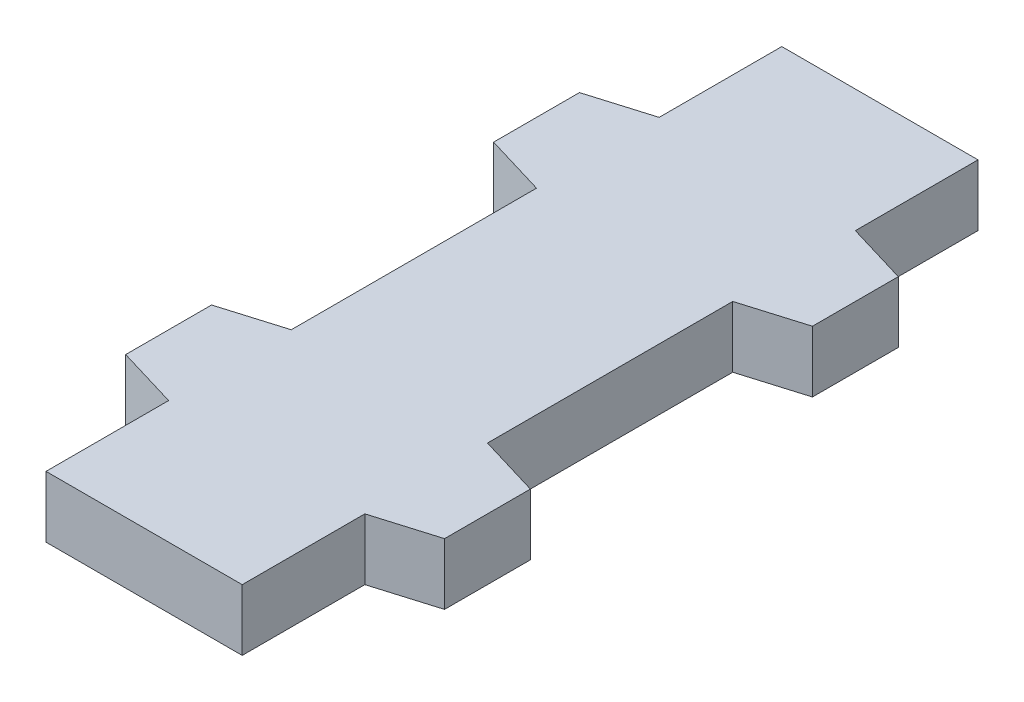
ISO-10303-21;
HEADER;
FILE_DESCRIPTION(('STEP AP214'),'2;1');
FILE_NAME('part.step','',(''),(''),'','','');
FILE_SCHEMA(('AUTOMOTIVE_DESIGN { 1 0 10303 214 1 1 1 1 }'));
ENDSEC;
DATA;
#1=APPLICATION_CONTEXT('core data for automotive mechanical design processes');
#2=APPLICATION_PROTOCOL_DEFINITION('international standard','automotive_design',2000,#1);
#3=PRODUCT_CONTEXT('',#1,'mechanical');
#4=PRODUCT('Part','Part','',(#3));
#5=PRODUCT_RELATED_PRODUCT_CATEGORY('part','',(#4));
#6=PRODUCT_DEFINITION_FORMATION('','',#4);
#7=PRODUCT_DEFINITION_CONTEXT('part definition',#1,'design');
#8=PRODUCT_DEFINITION('design','',#6,#7);
#9=PRODUCT_DEFINITION_SHAPE('','',#8);
#10=(LENGTH_UNIT() NAMED_UNIT(*) SI_UNIT(.MILLI.,.METRE.));
#11=(NAMED_UNIT(*) PLANE_ANGLE_UNIT() SI_UNIT($,.RADIAN.));
#12=(NAMED_UNIT(*) SI_UNIT($,.STERADIAN.) SOLID_ANGLE_UNIT());
#13=UNCERTAINTY_MEASURE_WITH_UNIT(LENGTH_MEASURE(1.E-05),#10,'distance_accuracy_value','');
#14=(GEOMETRIC_REPRESENTATION_CONTEXT(3) GLOBAL_UNCERTAINTY_ASSIGNED_CONTEXT((#13)) GLOBAL_UNIT_ASSIGNED_CONTEXT((#10,
#11,#12)) REPRESENTATION_CONTEXT('',''));
#15=CARTESIAN_POINT('',(0.,0.,0.));
#16=DIRECTION('',(0.,0.,1.));
#17=DIRECTION('',(1.,0.,0.));
#18=AXIS2_PLACEMENT_3D('',#15,#16,#17);
#19=CARTESIAN_POINT('',(8.,2.5,-20.));
#20=DIRECTION('',(-1.,0.,0.));
#21=DIRECTION('',(0.,0.,1.));
#22=AXIS2_PLACEMENT_3D('',#19,#20,#21);
#23=PLANE('',#22);
#24=DIRECTION('',(0.,0.,-1.));
#25=VECTOR('',#24,1.);
#26=CARTESIAN_POINT('',(8.,-2.5,-20.));
#27=LINE('',#26,#25);
#28=CARTESIAN_POINT('',(8.,-2.5,-20.));
#29=VERTEX_POINT('',#28);
#30=CARTESIAN_POINT('',(8.,-2.5,-30.));
#31=VERTEX_POINT('',#30);
#32=EDGE_CURVE('E212',#29,#31,#27,.T.);
#33=ORIENTED_EDGE('',*,*,#32,.T.);
#34=DIRECTION('',(0.,-1.,0.));
#35=VECTOR('',#34,1.);
#36=CARTESIAN_POINT('',(8.,2.5,-30.));
#37=LINE('',#36,#35);
#38=CARTESIAN_POINT('',(8.,2.5,-30.));
#39=VERTEX_POINT('',#38);
#40=EDGE_CURVE('E11',#39,#31,#37,.T.);
#41=ORIENTED_EDGE('',*,*,#40,.F.);
#42=DIRECTION('',(0.,0.,-1.));
#43=VECTOR('',#42,1.);
#44=CARTESIAN_POINT('',(8.,2.5,-20.));
#45=LINE('',#44,#43);
#46=CARTESIAN_POINT('',(8.,2.5,-20.));
#47=VERTEX_POINT('',#46);
#48=EDGE_CURVE('E270',#47,#39,#45,.T.);
#49=ORIENTED_EDGE('',*,*,#48,.F.);
#50=DIRECTION('',(0.,-1.,0.));
#51=VECTOR('',#50,1.);
#52=CARTESIAN_POINT('',(8.,2.5,-20.));
#53=LINE('',#52,#51);
#54=EDGE_CURVE('E208',#47,#29,#53,.T.);
#55=ORIENTED_EDGE('',*,*,#54,.T.);
#56=EDGE_LOOP('',(#33,#41,#49,#55));
#57=FACE_BOUND('',#56,.T.);
#58=ADVANCED_FACE('F39',(#57),#23,.F.);
#59=CARTESIAN_POINT('',(-8.,2.5,-30.));
#60=DIRECTION('',(0.,0.,1.));
#61=DIRECTION('',(1.,0.,0.));
#62=AXIS2_PLACEMENT_3D('',#59,#60,#61);
#63=PLANE('',#62);
#64=DIRECTION('',(-1.,0.,0.));
#65=VECTOR('',#64,1.);
#66=CARTESIAN_POINT('',(-8.,-2.5,-30.));
#67=LINE('',#66,#65);
#68=CARTESIAN_POINT('',(-8.,-2.5,-30.));
#69=VERTEX_POINT('',#68);
#70=EDGE_CURVE('E216',#31,#69,#67,.T.);
#71=ORIENTED_EDGE('',*,*,#70,.T.);
#72=DIRECTION('',(0.,-1.,0.));
#73=VECTOR('',#72,1.);
#74=CARTESIAN_POINT('',(-8.,2.5,-30.));
#75=LINE('',#74,#73);
#76=CARTESIAN_POINT('',(-8.,2.5,-30.));
#77=VERTEX_POINT('',#76);
#78=EDGE_CURVE('E48',#77,#69,#75,.T.);
#79=ORIENTED_EDGE('',*,*,#78,.F.);
#80=DIRECTION('',(-1.,0.,0.));
#81=VECTOR('',#80,1.);
#82=CARTESIAN_POINT('',(-8.,2.5,-30.));
#83=LINE('',#82,#81);
#84=EDGE_CURVE('E135',#39,#77,#83,.T.);
#85=ORIENTED_EDGE('',*,*,#84,.F.);
#86=ORIENTED_EDGE('',*,*,#40,.T.);
#87=EDGE_LOOP('',(#71,#79,#85,#86));
#88=FACE_BOUND('',#87,.T.);
#89=ADVANCED_FACE('F420',(#88),#63,.F.);
#90=CARTESIAN_POINT('',(-8.00000000000001,2.5,-20.));
#91=DIRECTION('',(1.,0.,0.));
#92=DIRECTION('',(0.,0.,-1.));
#93=AXIS2_PLACEMENT_3D('',#90,#91,#92);
#94=PLANE('',#93);
#95=DIRECTION('',(0.,0.,1.));
#96=VECTOR('',#95,1.);
#97=CARTESIAN_POINT('',(-8.00000000000001,-2.5,-20.));
#98=LINE('',#97,#96);
#99=CARTESIAN_POINT('',(-8.00000000000001,-2.5,-20.));
#100=VERTEX_POINT('',#99);
#101=EDGE_CURVE('E219',#69,#100,#98,.T.);
#102=ORIENTED_EDGE('',*,*,#101,.T.);
#103=DIRECTION('',(0.,-1.,0.));
#104=VECTOR('',#103,1.);
#105=CARTESIAN_POINT('',(-8.00000000000001,2.5,-20.));
#106=LINE('',#105,#104);
#107=CARTESIAN_POINT('',(-8.00000000000001,2.5,-20.));
#108=VERTEX_POINT('',#107);
#109=EDGE_CURVE('E329',#108,#100,#106,.T.);
#110=ORIENTED_EDGE('',*,*,#109,.F.);
#111=DIRECTION('',(0.,0.,1.));
#112=VECTOR('',#111,1.);
#113=CARTESIAN_POINT('',(-8.00000000000001,2.5,-20.));
#114=LINE('',#113,#112);
#115=EDGE_CURVE('E339',#77,#108,#114,.T.);
#116=ORIENTED_EDGE('',*,*,#115,.F.);
#117=ORIENTED_EDGE('',*,*,#78,.T.);
#118=EDGE_LOOP('',(#102,#110,#116,#117));
#119=FACE_BOUND('',#118,.T.);
#120=ADVANCED_FACE('F337',(#119),#94,.F.);
#121=CARTESIAN_POINT('',(-8.00000000000001,2.5,-20.));
#122=DIRECTION('',(0.287347885566346,0.,0.957826285221151));
#123=DIRECTION('',(0.957826285221151,0.,-0.287347885566346));
#124=AXIS2_PLACEMENT_3D('',#121,#122,#123);
#125=PLANE('',#124);
#126=DIRECTION('',(-0.957826285221151,0.,0.287347885566346));
#127=VECTOR('',#126,1.);
#128=CARTESIAN_POINT('',(-8.00000000000001,-2.5,-20.));
#129=LINE('',#128,#127);
#130=CARTESIAN_POINT('',(-13.,-2.5,-18.5));
#131=VERTEX_POINT('',#130);
#132=EDGE_CURVE('E222',#100,#131,#129,.T.);
#133=ORIENTED_EDGE('',*,*,#132,.T.);
#134=DIRECTION('',(0.,-1.,0.));
#135=VECTOR('',#134,1.);
#136=CARTESIAN_POINT('',(-13.,2.5,-18.5));
#137=LINE('',#136,#135);
#138=CARTESIAN_POINT('',(-13.,2.5,-18.5));
#139=VERTEX_POINT('',#138);
#140=EDGE_CURVE('E325',#139,#131,#137,.T.);
#141=ORIENTED_EDGE('',*,*,#140,.F.);
#142=DIRECTION('',(-0.957826285221151,0.,0.287347885566346));
#143=VECTOR('',#142,1.);
#144=CARTESIAN_POINT('',(-8.00000000000001,2.5,-20.));
#145=LINE('',#144,#143);
#146=EDGE_CURVE('E358',#108,#139,#145,.T.);
#147=ORIENTED_EDGE('',*,*,#146,.F.);
#148=ORIENTED_EDGE('',*,*,#109,.T.);
#149=EDGE_LOOP('',(#133,#141,#147,#148));
#150=FACE_BOUND('',#149,.T.);
#151=ADVANCED_FACE('F348',(#150),#125,.F.);
#152=CARTESIAN_POINT('',(-13.,2.5,-18.5));
#153=DIRECTION('',(1.,0.,0.));
#154=DIRECTION('',(0.,0.,-1.));
#155=AXIS2_PLACEMENT_3D('',#152,#153,#154);
#156=PLANE('',#155);
#157=DIRECTION('',(0.,0.,1.));
#158=VECTOR('',#157,1.);
#159=CARTESIAN_POINT('',(-13.,-2.5,-18.5));
#160=LINE('',#159,#158);
#161=CARTESIAN_POINT('',(-13.,-2.5,-11.5));
#162=VERTEX_POINT('',#161);
#163=EDGE_CURVE('E225',#131,#162,#160,.T.);
#164=ORIENTED_EDGE('',*,*,#163,.T.);
#165=DIRECTION('',(0.,-1.,0.));
#166=VECTOR('',#165,1.);
#167=CARTESIAN_POINT('',(-13.,2.5,-11.5));
#168=LINE('',#167,#166);
#169=CARTESIAN_POINT('',(-13.,2.5,-11.5));
#170=VERTEX_POINT('',#169);
#171=EDGE_CURVE('E321',#170,#162,#168,.T.);
#172=ORIENTED_EDGE('',*,*,#171,.F.);
#173=DIRECTION('',(0.,0.,1.));
#174=VECTOR('',#173,1.);
#175=CARTESIAN_POINT('',(-13.,2.5,-18.5));
#176=LINE('',#175,#174);
#177=EDGE_CURVE('E354',#139,#170,#176,.T.);
#178=ORIENTED_EDGE('',*,*,#177,.F.);
#179=ORIENTED_EDGE('',*,*,#140,.T.);
#180=EDGE_LOOP('',(#164,#172,#178,#179));
#181=FACE_BOUND('',#180,.T.);
#182=ADVANCED_FACE('F352',(#181),#156,.F.);
#183=CARTESIAN_POINT('',(-13.,2.5,-11.5));
#184=DIRECTION('',(0.287347885566346,0.,-0.957826285221151));
#185=DIRECTION('',(-0.957826285221151,0.,-0.287347885566346));
#186=AXIS2_PLACEMENT_3D('',#183,#184,#185);
#187=PLANE('',#186);
#188=DIRECTION('',(0.957826285221151,0.,0.287347885566346));
#189=VECTOR('',#188,1.);
#190=CARTESIAN_POINT('',(-13.,-2.5,-11.5));
#191=LINE('',#190,#189);
#192=CARTESIAN_POINT('',(-8.,-2.5,-10.));
#193=VERTEX_POINT('',#192);
#194=EDGE_CURVE('E228',#162,#193,#191,.T.);
#195=ORIENTED_EDGE('',*,*,#194,.T.);
#196=DIRECTION('',(0.,-1.,0.));
#197=VECTOR('',#196,1.);
#198=CARTESIAN_POINT('',(-8.,2.5,-10.));
#199=LINE('',#198,#197);
#200=CARTESIAN_POINT('',(-8.,2.5,-10.));
#201=VERTEX_POINT('',#200);
#202=EDGE_CURVE('E317',#201,#193,#199,.T.);
#203=ORIENTED_EDGE('',*,*,#202,.F.);
#204=DIRECTION('',(0.957826285221151,0.,0.287347885566346));
#205=VECTOR('',#204,1.);
#206=CARTESIAN_POINT('',(-13.,2.5,-11.5));
#207=LINE('',#206,#205);
#208=EDGE_CURVE('E357',#170,#201,#207,.T.);
#209=ORIENTED_EDGE('',*,*,#208,.F.);
#210=ORIENTED_EDGE('',*,*,#171,.T.);
#211=EDGE_LOOP('',(#195,#203,#209,#210));
#212=FACE_BOUND('',#211,.T.);
#213=ADVANCED_FACE('F433',(#212),#187,.F.);
#214=CARTESIAN_POINT('',(-7.99999999999998,2.5,10.));
#215=DIRECTION('',(1.,0.,0.));
#216=DIRECTION('',(0.,0.,-1.));
#217=AXIS2_PLACEMENT_3D('',#214,#215,#216);
#218=PLANE('',#217);
#219=DIRECTION('',(0.,0.,1.));
#220=VECTOR('',#219,1.);
#221=CARTESIAN_POINT('',(-7.99999999999998,-2.5,10.));
#222=LINE('',#221,#220);
#223=CARTESIAN_POINT('',(-7.99999999999998,-2.5,10.));
#224=VERTEX_POINT('',#223);
#225=EDGE_CURVE('E231',#193,#224,#222,.T.);
#226=ORIENTED_EDGE('',*,*,#225,.T.);
#227=DIRECTION('',(0.,-1.,0.));
#228=VECTOR('',#227,1.);
#229=CARTESIAN_POINT('',(-7.99999999999998,2.5,10.));
#230=LINE('',#229,#228);
#231=CARTESIAN_POINT('',(-7.99999999999998,2.5,10.));
#232=VERTEX_POINT('',#231);
#233=EDGE_CURVE('E313',#232,#224,#230,.T.);
#234=ORIENTED_EDGE('',*,*,#233,.F.);
#235=DIRECTION('',(0.,0.,1.));
#236=VECTOR('',#235,1.);
#237=CARTESIAN_POINT('',(-7.99999999999998,2.5,10.));
#238=LINE('',#237,#236);
#239=EDGE_CURVE('E362',#201,#232,#238,.T.);
#240=ORIENTED_EDGE('',*,*,#239,.F.);
#241=ORIENTED_EDGE('',*,*,#202,.T.);
#242=EDGE_LOOP('',(#226,#234,#240,#241));
#243=FACE_BOUND('',#242,.T.);
#244=ADVANCED_FACE('F436',(#243),#218,.F.);
#245=CARTESIAN_POINT('',(-13.,2.5,11.5));
#246=DIRECTION('',(0.287347885566347,0.,0.957826285221151));
#247=DIRECTION('',(0.957826285221151,0.,-0.287347885566347));
#248=AXIS2_PLACEMENT_3D('',#245,#246,#247);
#249=PLANE('',#248);
#250=DIRECTION('',(-0.957826285221151,0.,0.287347885566347));
#251=VECTOR('',#250,1.);
#252=CARTESIAN_POINT('',(-13.,-2.5,11.5));
#253=LINE('',#252,#251);
#254=CARTESIAN_POINT('',(-13.,-2.5,11.5));
#255=VERTEX_POINT('',#254);
#256=EDGE_CURVE('E234',#224,#255,#253,.T.);
#257=ORIENTED_EDGE('',*,*,#256,.T.);
#258=DIRECTION('',(0.,-1.,0.));
#259=VECTOR('',#258,1.);
#260=CARTESIAN_POINT('',(-13.,2.5,11.5));
#261=LINE('',#260,#259);
#262=CARTESIAN_POINT('',(-13.,2.5,11.5));
#263=VERTEX_POINT('',#262);
#264=EDGE_CURVE('E309',#263,#255,#261,.T.);
#265=ORIENTED_EDGE('',*,*,#264,.F.);
#266=DIRECTION('',(-0.957826285221151,0.,0.287347885566347));
#267=VECTOR('',#266,1.);
#268=CARTESIAN_POINT('',(-13.,2.5,11.5));
#269=LINE('',#268,#267);
#270=EDGE_CURVE('E369',#232,#263,#269,.T.);
#271=ORIENTED_EDGE('',*,*,#270,.F.);
#272=ORIENTED_EDGE('',*,*,#233,.T.);
#273=EDGE_LOOP('',(#257,#265,#271,#272));
#274=FACE_BOUND('',#273,.T.);
#275=ADVANCED_FACE('F440',(#274),#249,.F.);
#276=CARTESIAN_POINT('',(-13.,2.5,18.5));
#277=DIRECTION('',(1.,0.,0.));
#278=DIRECTION('',(0.,0.,-1.));
#279=AXIS2_PLACEMENT_3D('',#276,#277,#278);
#280=PLANE('',#279);
#281=DIRECTION('',(0.,0.,1.));
#282=VECTOR('',#281,1.);
#283=CARTESIAN_POINT('',(-13.,-2.5,18.5));
#284=LINE('',#283,#282);
#285=CARTESIAN_POINT('',(-13.,-2.5,18.5));
#286=VERTEX_POINT('',#285);
#287=EDGE_CURVE('E237',#255,#286,#284,.T.);
#288=ORIENTED_EDGE('',*,*,#287,.T.);
#289=DIRECTION('',(0.,-1.,0.));
#290=VECTOR('',#289,1.);
#291=CARTESIAN_POINT('',(-13.,2.5,18.5));
#292=LINE('',#291,#290);
#293=CARTESIAN_POINT('',(-13.,2.5,18.5));
#294=VERTEX_POINT('',#293);
#295=EDGE_CURVE('E305',#294,#286,#292,.T.);
#296=ORIENTED_EDGE('',*,*,#295,.F.);
#297=DIRECTION('',(0.,0.,1.));
#298=VECTOR('',#297,1.);
#299=CARTESIAN_POINT('',(-13.,2.5,18.5));
#300=LINE('',#299,#298);
#301=EDGE_CURVE('E372',#263,#294,#300,.T.);
#302=ORIENTED_EDGE('',*,*,#301,.F.);
#303=ORIENTED_EDGE('',*,*,#264,.T.);
#304=EDGE_LOOP('',(#288,#296,#302,#303));
#305=FACE_BOUND('',#304,.T.);
#306=ADVANCED_FACE('F444',(#305),#280,.F.);
#307=CARTESIAN_POINT('',(-7.99999999999997,2.5,20.));
#308=DIRECTION('',(0.287347885566345,0.,-0.957826285221152));
#309=DIRECTION('',(-0.957826285221152,0.,-0.287347885566345));
#310=AXIS2_PLACEMENT_3D('',#307,#308,#309);
#311=PLANE('',#310);
#312=DIRECTION('',(0.957826285221152,0.,0.287347885566345));
#313=VECTOR('',#312,1.);
#314=CARTESIAN_POINT('',(-7.99999999999997,-2.5,20.));
#315=LINE('',#314,#313);
#316=CARTESIAN_POINT('',(-7.99999999999997,-2.5,20.));
#317=VERTEX_POINT('',#316);
#318=EDGE_CURVE('E240',#286,#317,#315,.T.);
#319=ORIENTED_EDGE('',*,*,#318,.T.);
#320=DIRECTION('',(0.,-1.,0.));
#321=VECTOR('',#320,1.);
#322=CARTESIAN_POINT('',(-7.99999999999997,2.5,20.));
#323=LINE('',#322,#321);
#324=CARTESIAN_POINT('',(-7.99999999999997,2.5,20.));
#325=VERTEX_POINT('',#324);
#326=EDGE_CURVE('E301',#325,#317,#323,.T.);
#327=ORIENTED_EDGE('',*,*,#326,.F.);
#328=DIRECTION('',(0.957826285221152,0.,0.287347885566345));
#329=VECTOR('',#328,1.);
#330=CARTESIAN_POINT('',(-7.99999999999997,2.5,20.));
#331=LINE('',#330,#329);
#332=EDGE_CURVE('E375',#294,#325,#331,.T.);
#333=ORIENTED_EDGE('',*,*,#332,.F.);
#334=ORIENTED_EDGE('',*,*,#295,.T.);
#335=EDGE_LOOP('',(#319,#327,#333,#334));
#336=FACE_BOUND('',#335,.T.);
#337=ADVANCED_FACE('F448',(#336),#311,.F.);
#338=CARTESIAN_POINT('',(-8.,2.5,30.));
#339=DIRECTION('',(1.,0.,0.));
#340=DIRECTION('',(0.,0.,-1.));
#341=AXIS2_PLACEMENT_3D('',#338,#339,#340);
#342=PLANE('',#341);
#343=DIRECTION('',(0.,0.,1.));
#344=VECTOR('',#343,1.);
#345=CARTESIAN_POINT('',(-8.,-2.5,30.));
#346=LINE('',#345,#344);
#347=CARTESIAN_POINT('',(-8.,-2.5,30.));
#348=VERTEX_POINT('',#347);
#349=EDGE_CURVE('E243',#317,#348,#346,.T.);
#350=ORIENTED_EDGE('',*,*,#349,.T.);
#351=DIRECTION('',(0.,-1.,0.));
#352=VECTOR('',#351,1.);
#353=CARTESIAN_POINT('',(-8.,2.5,30.));
#354=LINE('',#353,#352);
#355=CARTESIAN_POINT('',(-8.,2.5,30.));
#356=VERTEX_POINT('',#355);
#357=EDGE_CURVE('E297',#356,#348,#354,.T.);
#358=ORIENTED_EDGE('',*,*,#357,.F.);
#359=DIRECTION('',(0.,0.,1.));
#360=VECTOR('',#359,1.);
#361=CARTESIAN_POINT('',(-8.,2.5,30.));
#362=LINE('',#361,#360);
#363=EDGE_CURVE('E378',#325,#356,#362,.T.);
#364=ORIENTED_EDGE('',*,*,#363,.F.);
#365=ORIENTED_EDGE('',*,*,#326,.T.);
#366=EDGE_LOOP('',(#350,#358,#364,#365));
#367=FACE_BOUND('',#366,.T.);
#368=ADVANCED_FACE('F452',(#367),#342,.F.);
#369=CARTESIAN_POINT('',(-8.,2.5,30.));
#370=DIRECTION('',(0.,0.,-1.));
#371=DIRECTION('',(-1.,0.,0.));
#372=AXIS2_PLACEMENT_3D('',#369,#370,#371);
#373=PLANE('',#372);
#374=DIRECTION('',(1.,0.,0.));
#375=VECTOR('',#374,1.);
#376=CARTESIAN_POINT('',(-8.,-2.5,30.));
#377=LINE('',#376,#375);
#378=CARTESIAN_POINT('',(8.,-2.5,30.));
#379=VERTEX_POINT('',#378);
#380=EDGE_CURVE('E246',#348,#379,#377,.T.);
#381=ORIENTED_EDGE('',*,*,#380,.T.);
#382=DIRECTION('',(0.,-1.,0.));
#383=VECTOR('',#382,1.);
#384=CARTESIAN_POINT('',(8.,2.5,30.));
#385=LINE('',#384,#383);
#386=CARTESIAN_POINT('',(8.,2.5,30.));
#387=VERTEX_POINT('',#386);
#388=EDGE_CURVE('E293',#387,#379,#385,.T.);
#389=ORIENTED_EDGE('',*,*,#388,.F.);
#390=DIRECTION('',(1.,0.,0.));
#391=VECTOR('',#390,1.);
#392=CARTESIAN_POINT('',(-8.,2.5,30.));
#393=LINE('',#392,#391);
#394=EDGE_CURVE('E381',#356,#387,#393,.T.);
#395=ORIENTED_EDGE('',*,*,#394,.F.);
#396=ORIENTED_EDGE('',*,*,#357,.T.);
#397=EDGE_LOOP('',(#381,#389,#395,#396));
#398=FACE_BOUND('',#397,.T.);
#399=ADVANCED_FACE('F456',(#398),#373,.F.);
#400=CARTESIAN_POINT('',(8.,2.5,30.));
#401=DIRECTION('',(-1.,0.,0.));
#402=DIRECTION('',(0.,0.,1.));
#403=AXIS2_PLACEMENT_3D('',#400,#401,#402);
#404=PLANE('',#403);
#405=DIRECTION('',(0.,0.,-1.));
#406=VECTOR('',#405,1.);
#407=CARTESIAN_POINT('',(8.,-2.5,30.));
#408=LINE('',#407,#406);
#409=CARTESIAN_POINT('',(8.00000000000004,-2.5,20.));
#410=VERTEX_POINT('',#409);
#411=EDGE_CURVE('E249',#379,#410,#408,.T.);
#412=ORIENTED_EDGE('',*,*,#411,.T.);
#413=DIRECTION('',(0.,-1.,0.));
#414=VECTOR('',#413,1.);
#415=CARTESIAN_POINT('',(8.00000000000004,2.5,20.));
#416=LINE('',#415,#414);
#417=CARTESIAN_POINT('',(8.00000000000004,2.5,20.));
#418=VERTEX_POINT('',#417);
#419=EDGE_CURVE('E289',#418,#410,#416,.T.);
#420=ORIENTED_EDGE('',*,*,#419,.F.);
#421=DIRECTION('',(0.,0.,-1.));
#422=VECTOR('',#421,1.);
#423=CARTESIAN_POINT('',(8.,2.5,30.));
#424=LINE('',#423,#422);
#425=EDGE_CURVE('E384',#387,#418,#424,.T.);
#426=ORIENTED_EDGE('',*,*,#425,.F.);
#427=ORIENTED_EDGE('',*,*,#388,.T.);
#428=EDGE_LOOP('',(#412,#420,#426,#427));
#429=FACE_BOUND('',#428,.T.);
#430=ADVANCED_FACE('F460',(#429),#404,.F.);
#431=CARTESIAN_POINT('',(8.00000000000004,2.5,20.));
#432=DIRECTION('',(-0.287347885566348,0.,-0.957826285221151));
#433=DIRECTION('',(-0.957826285221151,0.,0.287347885566348));
#434=AXIS2_PLACEMENT_3D('',#431,#432,#433);
#435=PLANE('',#434);
#436=DIRECTION('',(0.957826285221151,0.,-0.287347885566348));
#437=VECTOR('',#436,1.);
#438=CARTESIAN_POINT('',(8.00000000000004,-2.5,20.));
#439=LINE('',#438,#437);
#440=CARTESIAN_POINT('',(13.,-2.5,18.5));
#441=VERTEX_POINT('',#440);
#442=EDGE_CURVE('E252',#410,#441,#439,.T.);
#443=ORIENTED_EDGE('',*,*,#442,.T.);
#444=DIRECTION('',(0.,-1.,0.));
#445=VECTOR('',#444,1.);
#446=CARTESIAN_POINT('',(13.,2.5,18.5));
#447=LINE('',#446,#445);
#448=CARTESIAN_POINT('',(13.,2.5,18.5));
#449=VERTEX_POINT('',#448);
#450=EDGE_CURVE('E285',#449,#441,#447,.T.);
#451=ORIENTED_EDGE('',*,*,#450,.F.);
#452=DIRECTION('',(0.957826285221151,0.,-0.287347885566348));
#453=VECTOR('',#452,1.);
#454=CARTESIAN_POINT('',(8.00000000000004,2.5,20.));
#455=LINE('',#454,#453);
#456=EDGE_CURVE('E387',#418,#449,#455,.T.);
#457=ORIENTED_EDGE('',*,*,#456,.F.);
#458=ORIENTED_EDGE('',*,*,#419,.T.);
#459=EDGE_LOOP('',(#443,#451,#457,#458));
#460=FACE_BOUND('',#459,.T.);
#461=ADVANCED_FACE('F464',(#460),#435,.F.);
#462=CARTESIAN_POINT('',(13.,2.5,18.5));
#463=DIRECTION('',(-1.,0.,0.));
#464=DIRECTION('',(0.,0.,1.));
#465=AXIS2_PLACEMENT_3D('',#462,#463,#464);
#466=PLANE('',#465);
#467=DIRECTION('',(0.,0.,-1.));
#468=VECTOR('',#467,1.);
#469=CARTESIAN_POINT('',(13.,-2.5,18.5));
#470=LINE('',#469,#468);
#471=CARTESIAN_POINT('',(13.,-2.5,11.5));
#472=VERTEX_POINT('',#471);
#473=EDGE_CURVE('E255',#441,#472,#470,.T.);
#474=ORIENTED_EDGE('',*,*,#473,.T.);
#475=DIRECTION('',(0.,-1.,0.));
#476=VECTOR('',#475,1.);
#477=CARTESIAN_POINT('',(13.,2.5,11.5));
#478=LINE('',#477,#476);
#479=CARTESIAN_POINT('',(13.,2.5,11.5));
#480=VERTEX_POINT('',#479);
#481=EDGE_CURVE('E281',#480,#472,#478,.T.);
#482=ORIENTED_EDGE('',*,*,#481,.F.);
#483=DIRECTION('',(0.,0.,-1.));
#484=VECTOR('',#483,1.);
#485=CARTESIAN_POINT('',(13.,2.5,18.5));
#486=LINE('',#485,#484);
#487=EDGE_CURVE('E390',#449,#480,#486,.T.);
#488=ORIENTED_EDGE('',*,*,#487,.F.);
#489=ORIENTED_EDGE('',*,*,#450,.T.);
#490=EDGE_LOOP('',(#474,#482,#488,#489));
#491=FACE_BOUND('',#490,.T.);
#492=ADVANCED_FACE('F468',(#491),#466,.F.);
#493=CARTESIAN_POINT('',(13.,2.5,11.5));
#494=DIRECTION('',(-0.287347885566344,0.,0.957826285221152));
#495=DIRECTION('',(0.957826285221152,0.,0.287347885566344));
#496=AXIS2_PLACEMENT_3D('',#493,#494,#495);
#497=PLANE('',#496);
#498=DIRECTION('',(-0.957826285221152,0.,-0.287347885566344));
#499=VECTOR('',#498,1.);
#500=CARTESIAN_POINT('',(13.,-2.5,11.5));
#501=LINE('',#500,#499);
#502=CARTESIAN_POINT('',(8.00000000000001,-2.5,9.99999999999998));
#503=VERTEX_POINT('',#502);
#504=EDGE_CURVE('E258',#472,#503,#501,.T.);
#505=ORIENTED_EDGE('',*,*,#504,.T.);
#506=DIRECTION('',(0.,-1.,0.));
#507=VECTOR('',#506,1.);
#508=CARTESIAN_POINT('',(8.00000000000001,2.5,9.99999999999998));
#509=LINE('',#508,#507);
#510=CARTESIAN_POINT('',(8.00000000000001,2.5,9.99999999999998));
#511=VERTEX_POINT('',#510);
#512=EDGE_CURVE('E277',#511,#503,#509,.T.);
#513=ORIENTED_EDGE('',*,*,#512,.F.);
#514=DIRECTION('',(-0.957826285221152,0.,-0.287347885566344));
#515=VECTOR('',#514,1.);
#516=CARTESIAN_POINT('',(13.,2.5,11.5));
#517=LINE('',#516,#515);
#518=EDGE_CURVE('E393',#480,#511,#517,.T.);
#519=ORIENTED_EDGE('',*,*,#518,.F.);
#520=ORIENTED_EDGE('',*,*,#481,.T.);
#521=EDGE_LOOP('',(#505,#513,#519,#520));
#522=FACE_BOUND('',#521,.T.);
#523=ADVANCED_FACE('F401',(#522),#497,.F.);
#524=CARTESIAN_POINT('',(8.00000000000001,2.5,9.99999999999998));
#525=DIRECTION('',(-1.,0.,0.));
#526=DIRECTION('',(0.,0.,1.));
#527=AXIS2_PLACEMENT_3D('',#524,#525,#526);
#528=PLANE('',#527);
#529=DIRECTION('',(0.,0.,-1.));
#530=VECTOR('',#529,1.);
#531=CARTESIAN_POINT('',(8.00000000000001,-2.5,9.99999999999998));
#532=LINE('',#531,#530);
#533=CARTESIAN_POINT('',(7.99999999999999,-2.5,-10.));
#534=VERTEX_POINT('',#533);
#535=EDGE_CURVE('E261',#503,#534,#532,.T.);
#536=ORIENTED_EDGE('',*,*,#535,.T.);
#537=DIRECTION('',(0.,-1.,0.));
#538=VECTOR('',#537,1.);
#539=CARTESIAN_POINT('',(7.99999999999999,2.5,-10.));
#540=LINE('',#539,#538);
#541=CARTESIAN_POINT('',(7.99999999999999,2.5,-10.));
#542=VERTEX_POINT('',#541);
#543=EDGE_CURVE('E201',#542,#534,#540,.T.);
#544=ORIENTED_EDGE('',*,*,#543,.F.);
#545=DIRECTION('',(0.,0.,-1.));
#546=VECTOR('',#545,1.);
#547=CARTESIAN_POINT('',(8.00000000000001,2.5,9.99999999999998));
#548=LINE('',#547,#546);
#549=EDGE_CURVE('E190',#511,#542,#548,.T.);
#550=ORIENTED_EDGE('',*,*,#549,.F.);
#551=ORIENTED_EDGE('',*,*,#512,.T.);
#552=EDGE_LOOP('',(#536,#544,#550,#551));
#553=FACE_BOUND('',#552,.T.);
#554=ADVANCED_FACE('F405',(#553),#528,.F.);
#555=CARTESIAN_POINT('',(13.,2.5,-11.5));
#556=DIRECTION('',(-0.287347885566346,0.,-0.957826285221151));
#557=DIRECTION('',(-0.957826285221151,0.,0.287347885566346));
#558=AXIS2_PLACEMENT_3D('',#555,#556,#557);
#559=PLANE('',#558);
#560=DIRECTION('',(0.957826285221151,0.,-0.287347885566346));
#561=VECTOR('',#560,1.);
#562=CARTESIAN_POINT('',(13.,-2.5,-11.5));
#563=LINE('',#562,#561);
#564=CARTESIAN_POINT('',(13.,-2.5,-11.5));
#565=VERTEX_POINT('',#564);
#566=EDGE_CURVE('E199',#534,#565,#563,.T.);
#567=ORIENTED_EDGE('',*,*,#566,.T.);
#568=DIRECTION('',(0.,-1.,0.));
#569=VECTOR('',#568,1.);
#570=CARTESIAN_POINT('',(13.,2.5,-11.5));
#571=LINE('',#570,#569);
#572=CARTESIAN_POINT('',(13.,2.5,-11.5));
#573=VERTEX_POINT('',#572);
#574=EDGE_CURVE('E196',#573,#565,#571,.T.);
#575=ORIENTED_EDGE('',*,*,#574,.F.);
#576=DIRECTION('',(0.957826285221151,0.,-0.287347885566346));
#577=VECTOR('',#576,1.);
#578=CARTESIAN_POINT('',(13.,2.5,-11.5));
#579=LINE('',#578,#577);
#580=EDGE_CURVE('E184',#542,#573,#579,.T.);
#581=ORIENTED_EDGE('',*,*,#580,.F.);
#582=ORIENTED_EDGE('',*,*,#543,.T.);
#583=EDGE_LOOP('',(#567,#575,#581,#582));
#584=FACE_BOUND('',#583,.T.);
#585=ADVANCED_FACE('F197',(#584),#559,.F.);
#586=CARTESIAN_POINT('',(13.,2.5,-18.5));
#587=DIRECTION('',(-1.,0.,0.));
#588=DIRECTION('',(0.,0.,1.));
#589=AXIS2_PLACEMENT_3D('',#586,#587,#588);
#590=PLANE('',#589);
#591=DIRECTION('',(0.,0.,-1.));
#592=VECTOR('',#591,1.);
#593=CARTESIAN_POINT('',(13.,-2.5,-18.5));
#594=LINE('',#593,#592);
#595=CARTESIAN_POINT('',(13.,-2.5,-18.5));
#596=VERTEX_POINT('',#595);
#597=EDGE_CURVE('E121',#565,#596,#594,.T.);
#598=ORIENTED_EDGE('',*,*,#597,.T.);
#599=DIRECTION('',(0.,-1.,0.));
#600=VECTOR('',#599,1.);
#601=CARTESIAN_POINT('',(13.,2.5,-18.5));
#602=LINE('',#601,#600);
#603=CARTESIAN_POINT('',(13.,2.5,-18.5));
#604=VERTEX_POINT('',#603);
#605=EDGE_CURVE('E202',#604,#596,#602,.T.);
#606=ORIENTED_EDGE('',*,*,#605,.F.);
#607=DIRECTION('',(0.,0.,-1.));
#608=VECTOR('',#607,1.);
#609=CARTESIAN_POINT('',(13.,2.5,-18.5));
#610=LINE('',#609,#608);
#611=EDGE_CURVE('E188',#573,#604,#610,.T.);
#612=ORIENTED_EDGE('',*,*,#611,.F.);
#613=ORIENTED_EDGE('',*,*,#574,.T.);
#614=EDGE_LOOP('',(#598,#606,#612,#613));
#615=FACE_BOUND('',#614,.T.);
#616=ADVANCED_FACE('F204',(#615),#590,.F.);
#617=CARTESIAN_POINT('',(8.,2.5,-20.));
#618=DIRECTION('',(-0.287347885566346,0.,0.957826285221151));
#619=DIRECTION('',(0.957826285221151,0.,0.287347885566346));
#620=AXIS2_PLACEMENT_3D('',#617,#618,#619);
#621=PLANE('',#620);
#622=DIRECTION('',(-0.957826285221151,0.,-0.287347885566346));
#623=VECTOR('',#622,1.);
#624=CARTESIAN_POINT('',(8.,-2.5,-20.));
#625=LINE('',#624,#623);
#626=EDGE_CURVE('E127',#596,#29,#625,.T.);
#627=ORIENTED_EDGE('',*,*,#626,.T.);
#628=ORIENTED_EDGE('',*,*,#54,.F.);
#629=DIRECTION('',(-0.957826285221151,0.,-0.287347885566346));
#630=VECTOR('',#629,1.);
#631=CARTESIAN_POINT('',(8.,2.5,-20.));
#632=LINE('',#631,#630);
#633=EDGE_CURVE('E56',#604,#47,#632,.T.);
#634=ORIENTED_EDGE('',*,*,#633,.F.);
#635=ORIENTED_EDGE('',*,*,#605,.T.);
#636=EDGE_LOOP('',(#627,#628,#634,#635));
#637=FACE_BOUND('',#636,.T.);
#638=ADVANCED_FACE('F409',(#637),#621,.F.);
#639=CARTESIAN_POINT('',(0.,2.5,0.));
#640=DIRECTION('',(0.,-1.,0.));
#641=DIRECTION('',(0.,0.,-1.));
#642=AXIS2_PLACEMENT_3D('',#639,#640,#641);
#643=PLANE('',#642);
#644=ORIENTED_EDGE('',*,*,#48,.T.);
#645=ORIENTED_EDGE('',*,*,#84,.T.);
#646=ORIENTED_EDGE('',*,*,#115,.T.);
#647=ORIENTED_EDGE('',*,*,#146,.T.);
#648=ORIENTED_EDGE('',*,*,#177,.T.);
#649=ORIENTED_EDGE('',*,*,#208,.T.);
#650=ORIENTED_EDGE('',*,*,#239,.T.);
#651=ORIENTED_EDGE('',*,*,#270,.T.);
#652=ORIENTED_EDGE('',*,*,#301,.T.);
#653=ORIENTED_EDGE('',*,*,#332,.T.);
#654=ORIENTED_EDGE('',*,*,#363,.T.);
#655=ORIENTED_EDGE('',*,*,#394,.T.);
#656=ORIENTED_EDGE('',*,*,#425,.T.);
#657=ORIENTED_EDGE('',*,*,#456,.T.);
#658=ORIENTED_EDGE('',*,*,#487,.T.);
#659=ORIENTED_EDGE('',*,*,#518,.T.);
#660=ORIENTED_EDGE('',*,*,#549,.T.);
#661=ORIENTED_EDGE('',*,*,#580,.T.);
#662=ORIENTED_EDGE('',*,*,#611,.T.);
#663=ORIENTED_EDGE('',*,*,#633,.T.);
#664=EDGE_LOOP('',(#644,#645,#646,#647,#648,#649,#650,#651,#652,#653,#654,#655,#656,#657,#658,
#659,#660,#661,#662,#663));
#665=FACE_BOUND('',#664,.T.);
#666=ADVANCED_FACE('F186',(#665),#643,.F.);
#667=CARTESIAN_POINT('',(0.,-2.5,0.));
#668=DIRECTION('',(0.,-1.,0.));
#669=DIRECTION('',(0.,0.,-1.));
#670=AXIS2_PLACEMENT_3D('',#667,#668,#669);
#671=PLANE('',#670);
#672=ORIENTED_EDGE('',*,*,#32,.F.);
#673=ORIENTED_EDGE('',*,*,#626,.F.);
#674=ORIENTED_EDGE('',*,*,#597,.F.);
#675=ORIENTED_EDGE('',*,*,#566,.F.);
#676=ORIENTED_EDGE('',*,*,#535,.F.);
#677=ORIENTED_EDGE('',*,*,#504,.F.);
#678=ORIENTED_EDGE('',*,*,#473,.F.);
#679=ORIENTED_EDGE('',*,*,#442,.F.);
#680=ORIENTED_EDGE('',*,*,#411,.F.);
#681=ORIENTED_EDGE('',*,*,#380,.F.);
#682=ORIENTED_EDGE('',*,*,#349,.F.);
#683=ORIENTED_EDGE('',*,*,#318,.F.);
#684=ORIENTED_EDGE('',*,*,#287,.F.);
#685=ORIENTED_EDGE('',*,*,#256,.F.);
#686=ORIENTED_EDGE('',*,*,#225,.F.);
#687=ORIENTED_EDGE('',*,*,#194,.F.);
#688=ORIENTED_EDGE('',*,*,#163,.F.);
#689=ORIENTED_EDGE('',*,*,#132,.F.);
#690=ORIENTED_EDGE('',*,*,#101,.F.);
#691=ORIENTED_EDGE('',*,*,#70,.F.);
#692=EDGE_LOOP('',(#672,#673,#674,#675,#676,#677,#678,#679,#680,#681,#682,#683,#684,#685,#686,
#687,#688,#689,#690,#691));
#693=FACE_BOUND('',#692,.T.);
#694=ADVANCED_FACE('F343',(#693),#671,.T.);
#695=CLOSED_SHELL('',(#58,#89,#120,#151,#182,#213,#244,#275,#306,#337,#368,#399,#430,#461,#492,
#523,#554,#585,#616,#638,#666,#694));
#696=MANIFOLD_SOLID_BREP('B2',#695);
#697=ADVANCED_BREP_SHAPE_REPRESENTATION('',(#18,#696),#14);
#698=SHAPE_DEFINITION_REPRESENTATION(#9,#697);
ENDSEC;
END-ISO-10303-21;
